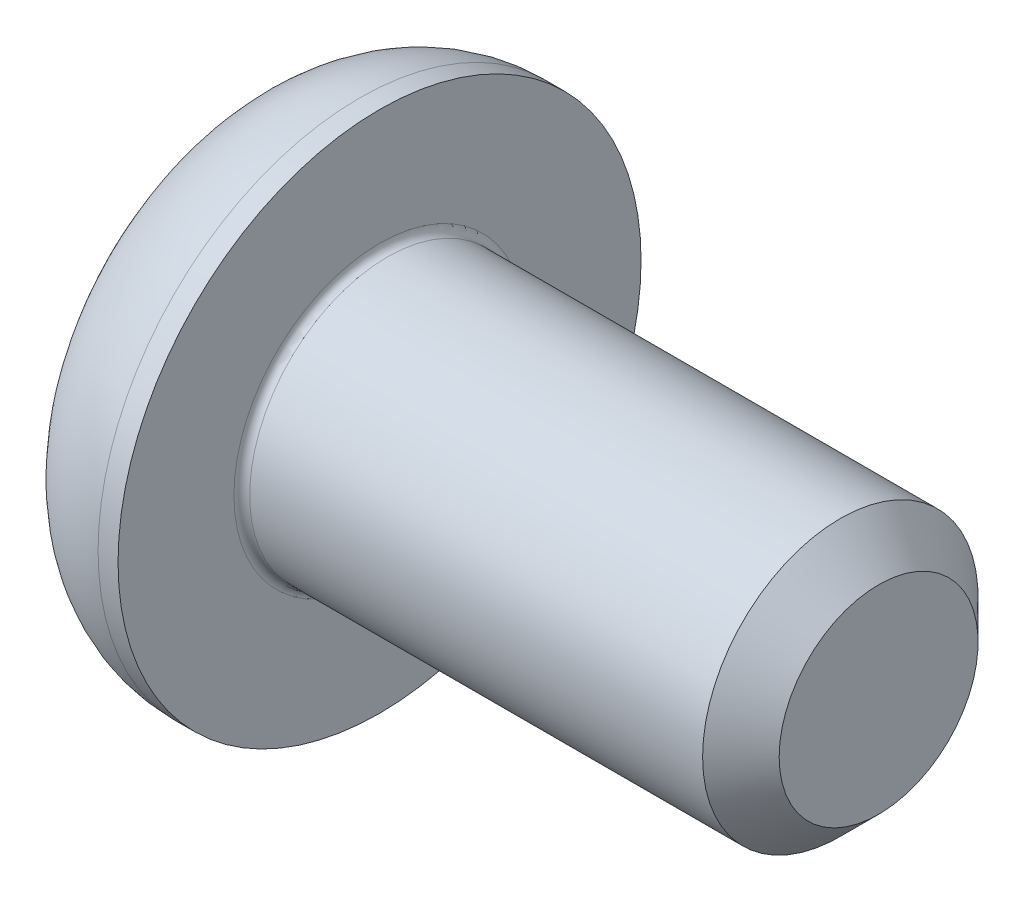
ISO-10303-21;
HEADER;
FILE_DESCRIPTION(('STEP AP214'),'2;1');
FILE_NAME('part.step','',(''),(''),'','','');
FILE_SCHEMA(('AUTOMOTIVE_DESIGN { 1 0 10303 214 1 1 1 1 }'));
ENDSEC;
DATA;
#1=APPLICATION_CONTEXT('core data for automotive mechanical design processes');
#2=APPLICATION_PROTOCOL_DEFINITION('international standard','automotive_design',2000,#1);
#3=PRODUCT_CONTEXT('',#1,'mechanical');
#4=PRODUCT('Part','Part','',(#3));
#5=PRODUCT_RELATED_PRODUCT_CATEGORY('part','',(#4));
#6=PRODUCT_DEFINITION_FORMATION('','',#4);
#7=PRODUCT_DEFINITION_CONTEXT('part definition',#1,'design');
#8=PRODUCT_DEFINITION('design','',#6,#7);
#9=PRODUCT_DEFINITION_SHAPE('','',#8);
#10=(LENGTH_UNIT() NAMED_UNIT(*) SI_UNIT(.MILLI.,.METRE.));
#11=(NAMED_UNIT(*) PLANE_ANGLE_UNIT() SI_UNIT($,.RADIAN.));
#12=(NAMED_UNIT(*) SI_UNIT($,.STERADIAN.) SOLID_ANGLE_UNIT());
#13=UNCERTAINTY_MEASURE_WITH_UNIT(LENGTH_MEASURE(1.E-05),#10,'distance_accuracy_value','');
#14=(GEOMETRIC_REPRESENTATION_CONTEXT(3) GLOBAL_UNCERTAINTY_ASSIGNED_CONTEXT((#13)) GLOBAL_UNIT_ASSIGNED_CONTEXT((#10,
#11,#12)) REPRESENTATION_CONTEXT('',''));
#15=CARTESIAN_POINT('',(0.,0.,0.));
#16=DIRECTION('',(0.,0.,1.));
#17=DIRECTION('',(1.,0.,0.));
#18=AXIS2_PLACEMENT_3D('',#15,#16,#17);
#19=CARTESIAN_POINT('',(-0.740562399982991,0.,0.));
#20=DIRECTION('',(-1.,0.,0.));
#21=DIRECTION('',(0.,0.,1.));
#22=AXIS2_PLACEMENT_3D('',#19,#20,#21);
#23=CONICAL_SURFACE('',#22,1.15070943149931,1.04719755120895);
#24=CARTESIAN_POINT('',(-0.0761999999667751,0.,0.));
#25=VERTEX_POINT('',#24);
#26=VERTEX_LOOP('',#25);
#27=FACE_BOUND('',#26,.T.);
#28=CARTESIAN_POINT('',(-0.736599999951941,0.9906,0.571923176673113));
#29=CARTESIAN_POINT('',(-0.722085503453293,0.9906,0.521658056828079));
#30=CARTESIAN_POINT('',(-0.708885328519864,0.9906,0.470959049183654));
#31=CARTESIAN_POINT('',(-0.685844819631468,0.9906,0.368683214490989));
#32=CARTESIAN_POINT('',(-0.676012635645502,0.9906,0.317104570790651));
#33=CARTESIAN_POINT('',(-0.660708132417732,0.9906,0.214586471665503));
#34=CARTESIAN_POINT('',(-0.655133941348257,0.990599999999999,0.163662785545678));
#35=CARTESIAN_POINT('',(-0.648480764925925,0.990599999999999,0.0615759255484741));
#36=CARTESIAN_POINT('',(-0.647396268845971,0.990599999999999,0.0104131224744705));
#37=CARTESIAN_POINT('',(-0.649658153463492,0.990599999999999,-0.0851790864582434));
#38=CARTESIAN_POINT('',(-0.652449166517253,0.990599999999999,-0.129622836706663));
#39=CARTESIAN_POINT('',(-0.661293250995229,0.990599999999999,-0.218220800667922));
#40=CARTESIAN_POINT('',(-0.667349340584516,0.990599999999999,-0.262374708172784));
#41=CARTESIAN_POINT('',(-0.682488392402428,0.990599999999999,-0.351155192295265));
#42=CARTESIAN_POINT('',(-0.691635498140969,0.990599999999999,-0.395770538212857));
#43=CARTESIAN_POINT('',(-0.712395561094716,0.990599999999999,-0.484335984624315));
#44=CARTESIAN_POINT('',(-0.724003643652405,0.990599999999999,-0.528287218868662));
#45=CARTESIAN_POINT('',(-0.736599999951942,0.990599999999999,-0.571923176673117));
#46=B_SPLINE_CURVE_WITH_KNOTS('',3,(#28,#29,#30,#31,#32,#33,#34,#35,#36,#37,#38,#39,#40,#41,#42,
#43,#44,#45),.UNSPECIFIED.,.F.,.F.,(4,2,2,2,2,2,2,2,4),(0.,0.157018030524315,0.314413377573935,
0.467913677328281,0.621225512272163,0.754692464745259,0.888283003200677,1.02483593963975,
1.16112088030985),.UNSPECIFIED.);
#47=CARTESIAN_POINT('',(-0.736599999951942,0.990600000006008,0.571923176662709));
#48=VERTEX_POINT('',#47);
#49=CARTESIAN_POINT('',(-0.73659999994994,0.990599999999999,-0.57192317666618));
#50=VERTEX_POINT('',#49);
#51=EDGE_CURVE('E21',#48,#50,#46,.T.);
#52=ORIENTED_EDGE('',*,*,#51,.T.);
#53=CARTESIAN_POINT('',(-0.736599999951942,0.990600000012012,-0.571923176652308));
#54=CARTESIAN_POINT('',(-0.722085503453293,0.947069129301944,-0.597055736574825));
#55=CARTESIAN_POINT('',(-0.708885328519864,0.90316250073521,-0.622405240397037));
#56=CARTESIAN_POINT('',(-0.685844819631468,0.814589029698104,-0.67354315774337));
#57=CARTESIAN_POINT('',(-0.676012635645502,0.769920613960866,-0.699332479593539));
#58=CARTESIAN_POINT('',(-0.660708132417733,0.681137335770796,-0.750591529156113));
#59=CARTESIAN_POINT('',(-0.655133941348257,0.637036129936682,-0.776053372216026));
#60=CARTESIAN_POINT('',(-0.648480764925925,0.548626315786518,-0.827096802214627));
#61=CARTESIAN_POINT('',(-0.647396268845971,0.50431802859561,-0.852678203751629));
#62=CARTESIAN_POINT('',(-0.649658153463492,0.42153274725601,-0.900474308217986));
#63=CARTESIAN_POINT('',(-0.652449166517253,0.383043330501428,-0.922696183342196));
#64=CARTESIAN_POINT('',(-0.66129325099523,0.306315242987399,-0.966995165322825));
#65=CARTESIAN_POINT('',(-0.667349340584516,0.268076837411841,-0.989072119075256));
#66=CARTESIAN_POINT('',(-0.682488392402428,0.191190682801491,-1.0334623611365));
#67=CARTESIAN_POINT('',(-0.691635498140969,0.152552659838226,-1.05577003409529));
#68=CARTESIAN_POINT('',(-0.712395561094716,0.0758527333483945,-1.10005275730102));
#69=CARTESIAN_POINT('',(-0.724003643652405,0.0377898479651099,-1.12202837442319));
#70=CARTESIAN_POINT('',(-0.736599999951942,-1.2014219827876E-11,-1.14384635332542));
#71=B_SPLINE_CURVE_WITH_KNOTS('',3,(#53,#54,#55,#56,#57,#58,#59,#60,#61,#62,#63,#64,#65,#66,#67,
#68,#69,#70),.UNSPECIFIED.,.F.,.F.,(4,2,2,2,2,2,2,2,4),(0.,0.157018030524315,0.314413377573936,
0.467913677328281,0.621225512272163,0.754692464745259,0.888283003200677,1.02483593963975,
1.16112088030985),.UNSPECIFIED.);
#72=CARTESIAN_POINT('',(-0.736599999951942,0.,-1.14384635332542));
#73=VERTEX_POINT('',#72);
#74=EDGE_CURVE('E81',#50,#73,#71,.T.);
#75=ORIENTED_EDGE('',*,*,#74,.T.);
#76=CARTESIAN_POINT('',(-0.736599999951942,1.20132457428811E-11,-1.14384635332542));
#77=CARTESIAN_POINT('',(-0.722085503453294,-0.043530870698055,-1.11871379340291));
#78=CARTESIAN_POINT('',(-0.708885328519865,-0.0874374992647889,-1.09336428958069));
#79=CARTESIAN_POINT('',(-0.685844819631469,-0.176010970301895,-1.04222637223436));
#80=CARTESIAN_POINT('',(-0.676012635645502,-0.220679386039133,-1.01643705038419));
#81=CARTESIAN_POINT('',(-0.660708132417733,-0.309462664229203,-0.965178000821617));
#82=CARTESIAN_POINT('',(-0.655133941348257,-0.353563870063317,-0.939716157761705));
#83=CARTESIAN_POINT('',(-0.648480764925925,-0.441973684213481,-0.888672727763103));
#84=CARTESIAN_POINT('',(-0.647396268845972,-0.486281971404388,-0.863091326226101));
#85=CARTESIAN_POINT('',(-0.649658153463492,-0.569067252743989,-0.815295221759744));
#86=CARTESIAN_POINT('',(-0.652449166517253,-0.607556669498571,-0.793073346635534));
#87=CARTESIAN_POINT('',(-0.66129325099523,-0.6842847570126,-0.748774364654905));
#88=CARTESIAN_POINT('',(-0.667349340584516,-0.722523162588158,-0.726697410902474));
#89=CARTESIAN_POINT('',(-0.682488392402428,-0.799409317198508,-0.682307168841233));
#90=CARTESIAN_POINT('',(-0.69163549814097,-0.838047340161773,-0.659999495882437));
#91=CARTESIAN_POINT('',(-0.712395561094716,-0.914747266651605,-0.615716772676708));
#92=CARTESIAN_POINT('',(-0.724003643652405,-0.95281015203489,-0.593741155554535));
#93=CARTESIAN_POINT('',(-0.736599999951942,-0.990600000012014,-0.571923176652307));
#94=B_SPLINE_CURVE_WITH_KNOTS('',3,(#76,#77,#78,#79,#80,#81,#82,#83,#84,#85,#86,#87,#88,#89,#90,
#91,#92,#93),.UNSPECIFIED.,.F.,.F.,(4,2,2,2,2,2,2,2,4),(0.,0.157018030524315,0.314413377573936,
0.467913677328281,0.621225512272163,0.75469246474526,0.888283003200678,1.02483593963975,
1.16112088030985),.UNSPECIFIED.);
#95=CARTESIAN_POINT('',(-0.736599999951942,-0.990600000006007,-0.571923176662711));
#96=VERTEX_POINT('',#95);
#97=EDGE_CURVE('E106',#73,#96,#94,.T.);
#98=ORIENTED_EDGE('',*,*,#97,.T.);
#99=CARTESIAN_POINT('',(-0.736599999951942,-0.9906,-0.571923176673116));
#100=CARTESIAN_POINT('',(-0.722085503453294,-0.9906,-0.521658056828082));
#101=CARTESIAN_POINT('',(-0.708885328519865,-0.9906,-0.470959049183656));
#102=CARTESIAN_POINT('',(-0.685844819631469,-0.9906,-0.368683214490992));
#103=CARTESIAN_POINT('',(-0.676012635645502,-0.9906,-0.317104570790654));
#104=CARTESIAN_POINT('',(-0.660708132417733,-0.9906,-0.214586471665505));
#105=CARTESIAN_POINT('',(-0.655133941348257,-0.9906,-0.16366278554568));
#106=CARTESIAN_POINT('',(-0.648480764925925,-0.9906,-0.0615759255484763));
#107=CARTESIAN_POINT('',(-0.647396268845971,-0.9906,-0.0104131224744727));
#108=CARTESIAN_POINT('',(-0.649658153463492,-0.9906,0.0851790864582413));
#109=CARTESIAN_POINT('',(-0.652449166517253,-0.990599999999999,0.129622836706661));
#110=CARTESIAN_POINT('',(-0.661293250995229,-0.990599999999999,0.21822080066792));
#111=CARTESIAN_POINT('',(-0.667349340584516,-0.990599999999999,0.262374708172782));
#112=CARTESIAN_POINT('',(-0.682488392402427,-0.990599999999999,0.351155192295264));
#113=CARTESIAN_POINT('',(-0.691635498140969,-0.990599999999999,0.395770538212856));
#114=CARTESIAN_POINT('',(-0.712395561094715,-0.990599999999999,0.484335984624314));
#115=CARTESIAN_POINT('',(-0.724003643652405,-0.990599999999999,0.52828721886866));
#116=CARTESIAN_POINT('',(-0.736599999951942,-0.990599999999999,0.571923176673116));
#117=B_SPLINE_CURVE_WITH_KNOTS('',3,(#99,#100,#101,#102,#103,#104,#105,#106,#107,#108,#109,#110,
#111,#112,#113,#114,#115,#116),.UNSPECIFIED.,.F.,.F.,(4,2,2,2,2,2,2,2,4),(0.,0.157018030524315,
0.314413377573936,0.467913677328281,0.621225512272164,0.75469246474526,0.888283003200678,
1.02483593963975,1.16112088030985),.UNSPECIFIED.);
#118=CARTESIAN_POINT('',(-0.736599999951942,-0.990600000006006,0.571923176662711));
#119=VERTEX_POINT('',#118);
#120=EDGE_CURVE('E130',#96,#119,#117,.T.);
#121=ORIENTED_EDGE('',*,*,#120,.T.);
#122=CARTESIAN_POINT('',(-0.736599999951942,-0.990600000012014,0.571923176652307));
#123=CARTESIAN_POINT('',(-0.722085503453294,-0.947069129301945,0.597055736574824));
#124=CARTESIAN_POINT('',(-0.708885328519864,-0.903162500735211,0.622405240397036));
#125=CARTESIAN_POINT('',(-0.685844819631469,-0.814589029698106,0.673543157743369));
#126=CARTESIAN_POINT('',(-0.676012635645502,-0.769920613960867,0.699332479593538));
#127=CARTESIAN_POINT('',(-0.660708132417733,-0.681137335770797,0.750591529156112));
#128=CARTESIAN_POINT('',(-0.655133941348257,-0.637036129936683,0.776053372216025));
#129=CARTESIAN_POINT('',(-0.648480764925925,-0.54862631578652,0.827096802214626));
#130=CARTESIAN_POINT('',(-0.647396268845971,-0.504318028595612,0.852678203751628));
#131=CARTESIAN_POINT('',(-0.649658153463492,-0.421532747256012,0.900474308217985));
#132=CARTESIAN_POINT('',(-0.652449166517253,-0.383043330501429,0.922696183342195));
#133=CARTESIAN_POINT('',(-0.661293250995229,-0.3063152429874,0.966995165322825));
#134=CARTESIAN_POINT('',(-0.667349340584516,-0.268076837411842,0.989072119075255));
#135=CARTESIAN_POINT('',(-0.682488392402428,-0.191190682801492,1.0334623611365));
#136=CARTESIAN_POINT('',(-0.691635498140969,-0.152552659838227,1.05577003409529));
#137=CARTESIAN_POINT('',(-0.712395561094716,-0.0758527333483951,1.10005275730102));
#138=CARTESIAN_POINT('',(-0.724003643652405,-0.0377898479651105,1.12202837442319));
#139=CARTESIAN_POINT('',(-0.736599999951942,1.20137714969873E-11,1.14384635332542));
#140=B_SPLINE_CURVE_WITH_KNOTS('',3,(#122,#123,#124,#125,#126,#127,#128,#129,#130,#131,#132,
#133,#134,#135,#136,#137,#138,#139),.UNSPECIFIED.,.F.,.F.,(4,2,2,2,2,2,2,2,4),(0.,
0.157018030524315,0.314413377573936,0.467913677328281,0.621225512272163,0.75469246474526,
0.888283003200678,1.02483593963975,1.16112088030985),.UNSPECIFIED.);
#141=CARTESIAN_POINT('',(-0.736599999951942,0.,1.14384635332542));
#142=VERTEX_POINT('',#141);
#143=EDGE_CURVE('E138',#119,#142,#140,.T.);
#144=ORIENTED_EDGE('',*,*,#143,.T.);
#145=CARTESIAN_POINT('',(-0.736599999951942,-1.20139986887607E-11,1.14384635332542));
#146=CARTESIAN_POINT('',(-0.722085503453294,0.0435308706980543,1.11871379340291));
#147=CARTESIAN_POINT('',(-0.708885328519864,0.0874374992647882,1.09336428958069));
#148=CARTESIAN_POINT('',(-0.685844819631469,0.176010970301894,1.04222637223436));
#149=CARTESIAN_POINT('',(-0.676012635645502,0.220679386039132,1.01643705038419));
#150=CARTESIAN_POINT('',(-0.660708132417733,0.309462664229202,0.965178000821617));
#151=CARTESIAN_POINT('',(-0.655133941348257,0.353563870063316,0.939716157761704));
#152=CARTESIAN_POINT('',(-0.648480764925925,0.44197368421348,0.888672727763102));
#153=CARTESIAN_POINT('',(-0.647396268845971,0.486281971404387,0.863091326226101));
#154=CARTESIAN_POINT('',(-0.649658153463491,0.569067252743988,0.815295221759743));
#155=CARTESIAN_POINT('',(-0.652449166517253,0.60755666949857,0.793073346635533));
#156=CARTESIAN_POINT('',(-0.661293250995229,0.6842847570126,0.748774364654903));
#157=CARTESIAN_POINT('',(-0.667349340584516,0.722523162588158,0.726697410902472));
#158=CARTESIAN_POINT('',(-0.682488392402427,0.799409317198509,0.682307168841231));
#159=CARTESIAN_POINT('',(-0.691635498140969,0.838047340161774,0.659999495882435));
#160=CARTESIAN_POINT('',(-0.712395561094716,0.914747266651606,0.615716772676706));
#161=CARTESIAN_POINT('',(-0.724003643652405,0.952810152034891,0.593741155554532));
#162=CARTESIAN_POINT('',(-0.736599999951942,0.990600000012015,0.571923176652304));
#163=B_SPLINE_CURVE_WITH_KNOTS('',3,(#145,#146,#147,#148,#149,#150,#151,#152,#153,#154,#155,
#156,#157,#158,#159,#160,#161,#162),.UNSPECIFIED.,.F.,.F.,(4,2,2,2,2,2,2,2,4),(0.,
0.157018030524316,0.314413377573936,0.467913677328281,0.621225512272164,0.754692464745261,
0.88828300320068,1.02483593963975,1.16112088030985),.UNSPECIFIED.);
#164=EDGE_CURVE('E83',#142,#48,#163,.T.);
#165=ORIENTED_EDGE('',*,*,#164,.T.);
#166=EDGE_LOOP('',(#52,#75,#98,#121,#144,#165));
#167=FACE_BOUND('',#166,.T.);
#168=ADVANCED_FACE('F17',(#27,#167),#23,.F.);
#169=CARTESIAN_POINT('',(-1.8542,0.9906,0.571923176659243));
#170=DIRECTION('',(0.,1.,0.));
#171=DIRECTION('',(0.,0.,1.));
#172=AXIS2_PLACEMENT_3D('',#169,#170,#171);
#173=PLANE('',#172);
#174=DIRECTION('',(1.,0.,0.));
#175=VECTOR('',#174,1.);
#176=CARTESIAN_POINT('',(-1.8542,0.990600000000002,0.57192317665924));
#177=LINE('',#176,#175);
#178=CARTESIAN_POINT('',(-1.8542,0.990600000000001,0.571923176659242));
#179=VERTEX_POINT('',#178);
#180=EDGE_CURVE('E85',#48,#179,#177,.F.);
#181=ORIENTED_EDGE('',*,*,#180,.T.);
#182=DIRECTION('',(0.,0.,1.));
#183=VECTOR('',#182,1.);
#184=CARTESIAN_POINT('',(-1.8542,0.9906,0.));
#185=LINE('',#184,#183);
#186=CARTESIAN_POINT('',(-1.8542,0.9906,-0.571923176659243));
#187=VERTEX_POINT('',#186);
#188=EDGE_CURVE('E90',#187,#179,#185,.T.);
#189=ORIENTED_EDGE('',*,*,#188,.F.);
#190=DIRECTION('',(1.,0.,0.));
#191=VECTOR('',#190,1.);
#192=CARTESIAN_POINT('',(-1.8542,0.9906,-0.571923176659243));
#193=LINE('',#192,#191);
#194=EDGE_CURVE('E88',#187,#50,#193,.T.);
#195=ORIENTED_EDGE('',*,*,#194,.T.);
#196=ORIENTED_EDGE('',*,*,#51,.F.);
#197=EDGE_LOOP('',(#181,#189,#195,#196));
#198=FACE_BOUND('',#197,.T.);
#199=ADVANCED_FACE('F77',(#198),#173,.F.);
#200=CARTESIAN_POINT('',(-1.8542,0.,1.14384635331849));
#201=DIRECTION('',(0.,0.500000000000001,0.866025403784438));
#202=DIRECTION('',(0.,-0.866025403784438,0.500000000000001));
#203=AXIS2_PLACEMENT_3D('',#200,#201,#202);
#204=PLANE('',#203);
#205=DIRECTION('',(1.,0.,0.));
#206=VECTOR('',#205,1.);
#207=CARTESIAN_POINT('',(-1.8542,0.,1.14384635331849));
#208=LINE('',#207,#206);
#209=CARTESIAN_POINT('',(-1.8542,0.,1.14384635331849));
#210=VERTEX_POINT('',#209);
#211=EDGE_CURVE('E142',#142,#210,#208,.F.);
#212=ORIENTED_EDGE('',*,*,#211,.T.);
#213=DIRECTION('',(0.,-0.866025403784439,0.5));
#214=VECTOR('',#213,1.);
#215=CARTESIAN_POINT('',(-1.8542,0.9906,0.571923176659243));
#216=LINE('',#215,#214);
#217=EDGE_CURVE('E96',#179,#210,#216,.T.);
#218=ORIENTED_EDGE('',*,*,#217,.F.);
#219=ORIENTED_EDGE('',*,*,#180,.F.);
#220=ORIENTED_EDGE('',*,*,#164,.F.);
#221=EDGE_LOOP('',(#212,#218,#219,#220));
#222=FACE_BOUND('',#221,.T.);
#223=ADVANCED_FACE('F146',(#222),#204,.F.);
#224=CARTESIAN_POINT('',(-1.8542,-0.9906,0.571923176659243));
#225=DIRECTION('',(0.,-0.5,0.866025403784439));
#226=DIRECTION('',(0.,-0.866025403784439,-0.5));
#227=AXIS2_PLACEMENT_3D('',#224,#225,#226);
#228=PLANE('',#227);
#229=DIRECTION('',(1.,0.,0.));
#230=VECTOR('',#229,1.);
#231=CARTESIAN_POINT('',(-1.8542,-0.990599999999999,0.571923176659243));
#232=LINE('',#231,#230);
#233=CARTESIAN_POINT('',(-1.8542,-0.990599999999999,0.571923176659243));
#234=VERTEX_POINT('',#233);
#235=EDGE_CURVE('E137',#119,#234,#232,.F.);
#236=ORIENTED_EDGE('',*,*,#235,.T.);
#237=DIRECTION('',(0.,-0.866025403784439,-0.5));
#238=VECTOR('',#237,1.);
#239=CARTESIAN_POINT('',(-1.8542,0.,1.14384635331849));
#240=LINE('',#239,#238);
#241=EDGE_CURVE('E265',#210,#234,#240,.T.);
#242=ORIENTED_EDGE('',*,*,#241,.F.);
#243=ORIENTED_EDGE('',*,*,#211,.F.);
#244=ORIENTED_EDGE('',*,*,#143,.F.);
#245=EDGE_LOOP('',(#236,#242,#243,#244));
#246=FACE_BOUND('',#245,.T.);
#247=ADVANCED_FACE('F126',(#246),#228,.F.);
#248=CARTESIAN_POINT('',(-1.8542,-0.9906,-0.571923176659243));
#249=DIRECTION('',(0.,-1.,0.));
#250=DIRECTION('',(0.,0.,-1.));
#251=AXIS2_PLACEMENT_3D('',#248,#249,#250);
#252=PLANE('',#251);
#253=DIRECTION('',(1.,0.,0.));
#254=VECTOR('',#253,1.);
#255=CARTESIAN_POINT('',(-1.8542,-0.9906,-0.571923176659243));
#256=LINE('',#255,#254);
#257=CARTESIAN_POINT('',(-1.8542,-0.9906,-0.571923176659243));
#258=VERTEX_POINT('',#257);
#259=EDGE_CURVE('E136',#96,#258,#256,.F.);
#260=ORIENTED_EDGE('',*,*,#259,.T.);
#261=DIRECTION('',(0.,0.,1.));
#262=VECTOR('',#261,1.);
#263=CARTESIAN_POINT('',(-1.8542,-0.9906,0.));
#264=LINE('',#263,#262);
#265=EDGE_CURVE('E260',#234,#258,#264,.F.);
#266=ORIENTED_EDGE('',*,*,#265,.F.);
#267=ORIENTED_EDGE('',*,*,#235,.F.);
#268=ORIENTED_EDGE('',*,*,#120,.F.);
#269=EDGE_LOOP('',(#260,#266,#267,#268));
#270=FACE_BOUND('',#269,.T.);
#271=ADVANCED_FACE('F122',(#270),#252,.F.);
#272=CARTESIAN_POINT('',(-1.8542,0.,-1.14384635331849));
#273=DIRECTION('',(0.,-0.5,-0.866025403784439));
#274=DIRECTION('',(0.,0.866025403784439,-0.5));
#275=AXIS2_PLACEMENT_3D('',#272,#273,#274);
#276=PLANE('',#275);
#277=DIRECTION('',(1.,0.,0.));
#278=VECTOR('',#277,1.);
#279=CARTESIAN_POINT('',(-1.8542,0.,-1.14384635331849));
#280=LINE('',#279,#278);
#281=CARTESIAN_POINT('',(-1.8542,0.,-1.14384635331849));
#282=VERTEX_POINT('',#281);
#283=EDGE_CURVE('E39',#73,#282,#280,.F.);
#284=ORIENTED_EDGE('',*,*,#283,.T.);
#285=DIRECTION('',(0.,0.866025403784439,-0.5));
#286=VECTOR('',#285,1.);
#287=CARTESIAN_POINT('',(-1.8542,-0.9906,-0.571923176659243));
#288=LINE('',#287,#286);
#289=EDGE_CURVE('E255',#258,#282,#288,.T.);
#290=ORIENTED_EDGE('',*,*,#289,.F.);
#291=ORIENTED_EDGE('',*,*,#259,.F.);
#292=ORIENTED_EDGE('',*,*,#97,.F.);
#293=EDGE_LOOP('',(#284,#290,#291,#292));
#294=FACE_BOUND('',#293,.T.);
#295=ADVANCED_FACE('F116',(#294),#276,.F.);
#296=CARTESIAN_POINT('',(-1.8542,0.9906,-0.571923176659243));
#297=DIRECTION('',(0.,0.5,-0.866025403784439));
#298=DIRECTION('',(0.,0.866025403784439,0.5));
#299=AXIS2_PLACEMENT_3D('',#296,#297,#298);
#300=PLANE('',#299);
#301=ORIENTED_EDGE('',*,*,#194,.F.);
#302=DIRECTION('',(0.,0.866025403784439,0.5));
#303=VECTOR('',#302,1.);
#304=CARTESIAN_POINT('',(-1.8542,0.,-1.14384635331849));
#305=LINE('',#304,#303);
#306=EDGE_CURVE('E253',#282,#187,#305,.T.);
#307=ORIENTED_EDGE('',*,*,#306,.F.);
#308=ORIENTED_EDGE('',*,*,#283,.F.);
#309=ORIENTED_EDGE('',*,*,#74,.F.);
#310=EDGE_LOOP('',(#301,#307,#308,#309));
#311=FACE_BOUND('',#310,.T.);
#312=ADVANCED_FACE('F94',(#311),#300,.F.);
#313=CARTESIAN_POINT('',(-1.8542,2.23562317665924,0.));
#314=DIRECTION('',(-1.,0.,0.));
#315=DIRECTION('',(0.,-1.,0.));
#316=AXIS2_PLACEMENT_3D('',#313,#314,#315);
#317=PLANE('',#316);
#318=ORIENTED_EDGE('',*,*,#289,.T.);
#319=ORIENTED_EDGE('',*,*,#306,.T.);
#320=ORIENTED_EDGE('',*,*,#188,.T.);
#321=ORIENTED_EDGE('',*,*,#217,.T.);
#322=ORIENTED_EDGE('',*,*,#241,.T.);
#323=ORIENTED_EDGE('',*,*,#265,.T.);
#324=EDGE_LOOP('',(#318,#319,#320,#321,#322,#323));
#325=FACE_BOUND('',#324,.T.);
#326=CARTESIAN_POINT('',(-1.8542,0.,0.));
#327=DIRECTION('',(1.,0.,0.));
#328=DIRECTION('',(0.,1.,0.));
#329=AXIS2_PLACEMENT_3D('',#326,#327,#328);
#330=CIRCLE('',#329,1.7272);
#331=CARTESIAN_POINT('',(-1.8542,1.7272,0.));
#332=VERTEX_POINT('',#331);
#333=EDGE_CURVE('E216',#332,#332,#330,.T.);
#334=ORIENTED_EDGE('',*,*,#333,.F.);
#335=EDGE_LOOP('',(#334));
#336=FACE_BOUND('',#335,.T.);
#337=ADVANCED_FACE('F115',(#325,#336),#317,.T.);
#338=CARTESIAN_POINT('',(-0.253999999999997,0.,0.));
#339=DIRECTION('',(1.,0.,0.));
#340=DIRECTION('',(0.,0.,-1.));
#341=AXIS2_PLACEMENT_3D('',#338,#339,#340);
#342=TOROIDAL_SURFACE('',#341,1.7272,1.6002);
#343=CARTESIAN_POINT('',(-0.253999999999997,0.,0.));
#344=DIRECTION('',(1.,0.,0.));
#345=DIRECTION('',(0.,1.,0.));
#346=AXIS2_PLACEMENT_3D('',#343,#344,#345);
#347=CIRCLE('',#346,3.3274);
#348=CARTESIAN_POINT('',(-0.253999999999997,3.3274,0.));
#349=VERTEX_POINT('',#348);
#350=EDGE_CURVE('E280',#349,#349,#347,.T.);
#351=ORIENTED_EDGE('',*,*,#350,.F.);
#352=EDGE_LOOP('',(#351));
#353=FACE_BOUND('',#352,.T.);
#354=ORIENTED_EDGE('',*,*,#333,.T.);
#355=EDGE_LOOP('',(#354));
#356=FACE_BOUND('',#355,.T.);
#357=ADVANCED_FACE('F200',(#353,#356),#342,.T.);
#358=CARTESIAN_POINT('',(-0.927099999999997,0.,0.));
#359=DIRECTION('',(1.,0.,0.));
#360=DIRECTION('',(0.,1.,0.));
#361=AXIS2_PLACEMENT_3D('',#358,#359,#360);
#362=CYLINDRICAL_SURFACE('',#361,3.3274);
#363=ORIENTED_EDGE('',*,*,#350,.T.);
#364=EDGE_LOOP('',(#363));
#365=FACE_BOUND('',#364,.T.);
#366=CARTESIAN_POINT('',(0.,0.,0.));
#367=DIRECTION('',(1.,0.,0.));
#368=DIRECTION('',(0.,1.,0.));
#369=AXIS2_PLACEMENT_3D('',#366,#367,#368);
#370=CIRCLE('',#369,3.3274);
#371=CARTESIAN_POINT('',(0.,3.3274,0.));
#372=VERTEX_POINT('',#371);
#373=EDGE_CURVE('E104',#372,#372,#370,.T.);
#374=ORIENTED_EDGE('',*,*,#373,.F.);
#375=EDGE_LOOP('',(#374));
#376=FACE_BOUND('',#375,.T.);
#377=ADVANCED_FACE('F197',(#365,#376),#362,.T.);
#378=CARTESIAN_POINT('',(6.35,0.8763,0.));
#379=DIRECTION('',(1.,0.,0.));
#380=DIRECTION('',(0.,1.,0.));
#381=AXIS2_PLACEMENT_3D('',#378,#379,#380);
#382=PLANE('',#381);
#383=CARTESIAN_POINT('',(6.34999999994079,0.,0.));
#384=DIRECTION('',(-1.,0.,0.));
#385=DIRECTION('',(0.,0.,1.));
#386=AXIS2_PLACEMENT_3D('',#383,#384,#385);
#387=CIRCLE('',#386,1.26568200005295);
#388=CARTESIAN_POINT('',(6.34999999994079,0.,1.26568200005295));
#389=VERTEX_POINT('',#388);
#390=EDGE_CURVE('E275',#389,#389,#387,.T.);
#391=ORIENTED_EDGE('',*,*,#390,.F.);
#392=EDGE_LOOP('',(#391));
#393=FACE_BOUND('',#392,.T.);
#394=ADVANCED_FACE('F194',(#393),#382,.T.);
#395=CARTESIAN_POINT('',(0.,2.54,0.));
#396=DIRECTION('',(1.,0.,0.));
#397=DIRECTION('',(0.,1.,0.));
#398=AXIS2_PLACEMENT_3D('',#395,#396,#397);
#399=PLANE('',#398);
#400=CARTESIAN_POINT('',(0.,0.,0.));
#401=DIRECTION('',(1.,0.,0.));
#402=DIRECTION('',(0.,1.,0.));
#403=AXIS2_PLACEMENT_3D('',#400,#401,#402);
#404=CIRCLE('',#403,1.8526);
#405=CARTESIAN_POINT('',(0.,1.8526,0.));
#406=VERTEX_POINT('',#405);
#407=EDGE_CURVE('E181',#406,#406,#404,.F.);
#408=ORIENTED_EDGE('',*,*,#407,.T.);
#409=EDGE_LOOP('',(#408));
#410=FACE_BOUND('',#409,.T.);
#411=ORIENTED_EDGE('',*,*,#373,.T.);
#412=EDGE_LOOP('',(#411));
#413=FACE_BOUND('',#412,.T.);
#414=ADVANCED_FACE('F185',(#410,#413),#399,.T.);
#415=CARTESIAN_POINT('',(5.86308200001895,0.,0.));
#416=DIRECTION('',(-1.,0.,0.));
#417=DIRECTION('',(0.,0.,1.));
#418=AXIS2_PLACEMENT_3D('',#415,#416,#417);
#419=CONICAL_SURFACE('',#418,1.75259999991795,0.785398163339078);
#420=ORIENTED_EDGE('',*,*,#390,.T.);
#421=EDGE_LOOP('',(#420));
#422=FACE_BOUND('',#421,.T.);
#423=CARTESIAN_POINT('',(5.863082,0.,0.));
#424=DIRECTION('',(1.,0.,0.));
#425=DIRECTION('',(0.,1.,0.));
#426=AXIS2_PLACEMENT_3D('',#423,#424,#425);
#427=CIRCLE('',#426,1.7526);
#428=CARTESIAN_POINT('',(5.863082,1.7526,0.));
#429=VERTEX_POINT('',#428);
#430=EDGE_CURVE('E30',#429,#429,#427,.F.);
#431=ORIENTED_EDGE('',*,*,#430,.F.);
#432=EDGE_LOOP('',(#431));
#433=FACE_BOUND('',#432,.T.);
#434=ADVANCED_FACE('F163',(#422,#433),#419,.T.);
#435=CARTESIAN_POINT('',(0.100000000000002,0.,0.));
#436=DIRECTION('',(1.,0.,0.));
#437=DIRECTION('',(0.,0.,-1.));
#438=AXIS2_PLACEMENT_3D('',#435,#436,#437);
#439=TOROIDAL_SURFACE('',#438,1.8526,0.1);
#440=CARTESIAN_POINT('',(0.100000000000002,0.,0.));
#441=DIRECTION('',(1.,0.,0.));
#442=DIRECTION('',(0.,1.,0.));
#443=AXIS2_PLACEMENT_3D('',#440,#441,#442);
#444=CIRCLE('',#443,1.7526);
#445=CARTESIAN_POINT('',(0.100000000000002,1.7526,0.));
#446=VERTEX_POINT('',#445);
#447=EDGE_CURVE('E11',#446,#446,#444,.T.);
#448=ORIENTED_EDGE('',*,*,#447,.F.);
#449=EDGE_LOOP('',(#448));
#450=FACE_BOUND('',#449,.T.);
#451=ORIENTED_EDGE('',*,*,#407,.F.);
#452=EDGE_LOOP('',(#451));
#453=FACE_BOUND('',#452,.T.);
#454=ADVANCED_FACE('F157',(#450,#453),#439,.F.);
#455=CARTESIAN_POINT('',(3.9701199998,0.,0.));
#456=DIRECTION('',(1.,0.,0.));
#457=DIRECTION('',(0.,1.,0.));
#458=AXIS2_PLACEMENT_3D('',#455,#456,#457);
#459=CYLINDRICAL_SURFACE('',#458,1.7526);
#460=ORIENTED_EDGE('',*,*,#447,.T.);
#461=EDGE_LOOP('',(#460));
#462=FACE_BOUND('',#461,.T.);
#463=ORIENTED_EDGE('',*,*,#430,.T.);
#464=EDGE_LOOP('',(#463));
#465=FACE_BOUND('',#464,.T.);
#466=ADVANCED_FACE('F155',(#462,#465),#459,.T.);
#467=CLOSED_SHELL('',(#168,#199,#223,#247,#271,#295,#312,#337,#357,#377,#394,#414,#434,#454,#466));
#468=MANIFOLD_SOLID_BREP('B1',#467);
#469=ADVANCED_BREP_SHAPE_REPRESENTATION('',(#18,#468),#14);
#470=SHAPE_DEFINITION_REPRESENTATION(#9,#469);
ENDSEC;
END-ISO-10303-21;
